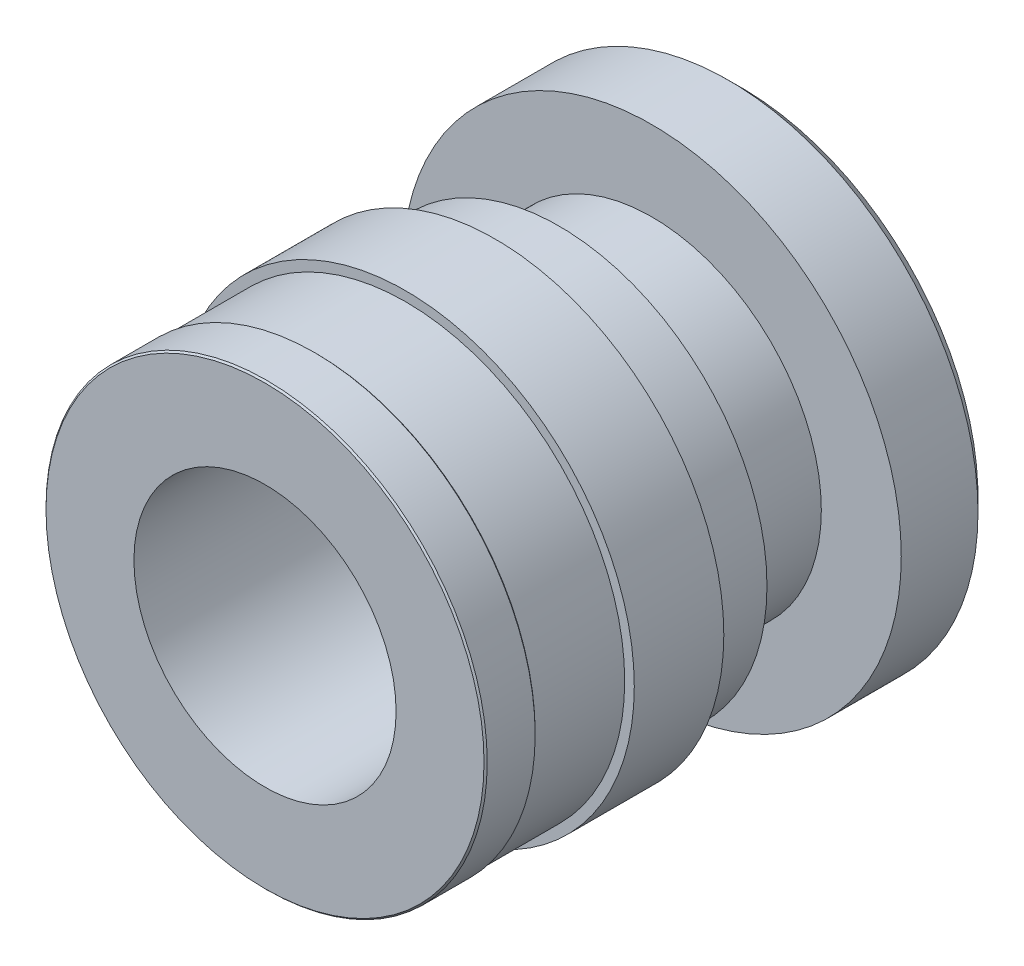
ISO-10303-21;
HEADER;
FILE_DESCRIPTION(('STEP AP214'),'2;1');
FILE_NAME('part.step','',(''),(''),'','','');
FILE_SCHEMA(('AUTOMOTIVE_DESIGN { 1 0 10303 214 1 1 1 1 }'));
ENDSEC;
DATA;
#1=APPLICATION_CONTEXT('core data for automotive mechanical design processes');
#2=APPLICATION_PROTOCOL_DEFINITION('international standard','automotive_design',2000,#1);
#3=PRODUCT_CONTEXT('',#1,'mechanical');
#4=PRODUCT('Part','Part','',(#3));
#5=PRODUCT_RELATED_PRODUCT_CATEGORY('part','',(#4));
#6=PRODUCT_DEFINITION_FORMATION('','',#4);
#7=PRODUCT_DEFINITION_CONTEXT('part definition',#1,'design');
#8=PRODUCT_DEFINITION('design','',#6,#7);
#9=PRODUCT_DEFINITION_SHAPE('','',#8);
#10=(LENGTH_UNIT() NAMED_UNIT(*) SI_UNIT(.MILLI.,.METRE.));
#11=(NAMED_UNIT(*) PLANE_ANGLE_UNIT() SI_UNIT($,.RADIAN.));
#12=(NAMED_UNIT(*) SI_UNIT($,.STERADIAN.) SOLID_ANGLE_UNIT());
#13=UNCERTAINTY_MEASURE_WITH_UNIT(LENGTH_MEASURE(1.E-05),#10,'distance_accuracy_value','');
#14=(GEOMETRIC_REPRESENTATION_CONTEXT(3) GLOBAL_UNCERTAINTY_ASSIGNED_CONTEXT((#13)) GLOBAL_UNIT_ASSIGNED_CONTEXT((#10,
#11,#12)) REPRESENTATION_CONTEXT('',''));
#15=CARTESIAN_POINT('',(0.,0.,0.));
#16=DIRECTION('',(0.,0.,1.));
#17=DIRECTION('',(1.,0.,0.));
#18=AXIS2_PLACEMENT_3D('',#15,#16,#17);
#19=CARTESIAN_POINT('',(0.02499999999999,-17.925,41.15));
#20=DIRECTION('',(0.,0.,1.));
#21=DIRECTION('',(1.,0.,0.));
#22=AXIS2_PLACEMENT_3D('',#19,#20,#21);
#23=PLANE('',#22);
#24=CARTESIAN_POINT('',(0.02499999999999,-17.925,41.15));
#25=DIRECTION('',(0.,0.,1.));
#26=DIRECTION('',(1.,0.,0.));
#27=AXIS2_PLACEMENT_3D('',#24,#25,#26);
#28=CIRCLE('',#27,2.65);
#29=CARTESIAN_POINT('',(2.67499999999999,-17.925,41.15));
#30=VERTEX_POINT('',#29);
#31=EDGE_CURVE('E41',#30,#30,#28,.T.);
#32=ORIENTED_EDGE('',*,*,#31,.T.);
#33=EDGE_LOOP('',(#32));
#34=FACE_BOUND('',#33,.T.);
#35=CARTESIAN_POINT('',(0.02499999999999,-17.925,41.15));
#36=DIRECTION('',(0.,0.,1.));
#37=DIRECTION('',(-1.,0.,0.));
#38=AXIS2_PLACEMENT_3D('',#35,#36,#37);
#39=CIRCLE('',#38,3.25);
#40=CARTESIAN_POINT('',(-3.22500000000001,-17.925,41.15));
#41=VERTEX_POINT('',#40);
#42=EDGE_CURVE('E10',#41,#41,#39,.T.);
#43=ORIENTED_EDGE('',*,*,#42,.F.);
#44=EDGE_LOOP('',(#43));
#45=FACE_BOUND('',#44,.T.);
#46=ADVANCED_FACE('F15',(#34,#45),#23,.F.);
#47=CARTESIAN_POINT('',(0.02499999999999,-17.925,41.15));
#48=DIRECTION('',(0.,0.,1.));
#49=DIRECTION('',(-1.,0.,0.));
#50=AXIS2_PLACEMENT_3D('',#47,#48,#49);
#51=CYLINDRICAL_SURFACE('',#50,3.25);
#52=ORIENTED_EDGE('',*,*,#42,.T.);
#53=EDGE_LOOP('',(#52));
#54=FACE_BOUND('',#53,.T.);
#55=CARTESIAN_POINT('',(0.02499999999999,-17.925,42.15));
#56=DIRECTION('',(0.,0.,-1.));
#57=DIRECTION('',(-1.,0.,0.));
#58=AXIS2_PLACEMENT_3D('',#55,#56,#57);
#59=CIRCLE('',#58,3.25);
#60=CARTESIAN_POINT('',(-3.22500000000001,-17.925,42.15));
#61=VERTEX_POINT('',#60);
#62=EDGE_CURVE('E18',#61,#61,#59,.T.);
#63=ORIENTED_EDGE('',*,*,#62,.T.);
#64=EDGE_LOOP('',(#63));
#65=FACE_BOUND('',#64,.T.);
#66=ADVANCED_FACE('F71',(#54,#65),#51,.T.);
#67=CARTESIAN_POINT('',(0.02499999999999,-17.925,42.15));
#68=DIRECTION('',(0.,0.,1.));
#69=DIRECTION('',(1.,0.,0.));
#70=AXIS2_PLACEMENT_3D('',#67,#68,#69);
#71=PLANE('',#70);
#72=ORIENTED_EDGE('',*,*,#62,.F.);
#73=EDGE_LOOP('',(#72));
#74=FACE_BOUND('',#73,.T.);
#75=CARTESIAN_POINT('',(0.02499999999999,-17.925,42.15));
#76=DIRECTION('',(0.,0.,1.));
#77=DIRECTION('',(-1.,0.,0.));
#78=AXIS2_PLACEMENT_3D('',#75,#76,#77);
#79=CIRCLE('',#78,3.575);
#80=CARTESIAN_POINT('',(-3.55000000000001,-17.925,42.15));
#81=VERTEX_POINT('',#80);
#82=EDGE_CURVE('E32',#81,#81,#79,.T.);
#83=ORIENTED_EDGE('',*,*,#82,.F.);
#84=EDGE_LOOP('',(#83));
#85=FACE_BOUND('',#84,.T.);
#86=ADVANCED_FACE('F68',(#74,#85),#71,.F.);
#87=CARTESIAN_POINT('',(0.02499999999999,-17.925,43.55));
#88=DIRECTION('',(0.,0.,1.));
#89=DIRECTION('',(1.,0.,0.));
#90=AXIS2_PLACEMENT_3D('',#87,#88,#89);
#91=PLANE('',#90);
#92=CARTESIAN_POINT('',(0.02499999999999,-17.925,43.55));
#93=DIRECTION('',(0.,0.,-1.));
#94=DIRECTION('',(-1.,0.,0.));
#95=AXIS2_PLACEMENT_3D('',#92,#93,#94);
#96=CIRCLE('',#95,3.425);
#97=CARTESIAN_POINT('',(-3.40000000000001,-17.925,43.55));
#98=VERTEX_POINT('',#97);
#99=EDGE_CURVE('E52',#98,#98,#96,.T.);
#100=ORIENTED_EDGE('',*,*,#99,.T.);
#101=EDGE_LOOP('',(#100));
#102=FACE_BOUND('',#101,.T.);
#103=CARTESIAN_POINT('',(0.02499999999999,-17.925,43.55));
#104=DIRECTION('',(0.,0.,1.));
#105=DIRECTION('',(-1.,0.,0.));
#106=AXIS2_PLACEMENT_3D('',#103,#104,#105);
#107=CIRCLE('',#106,3.575);
#108=CARTESIAN_POINT('',(-3.55000000000001,-17.925,43.55));
#109=VERTEX_POINT('',#108);
#110=EDGE_CURVE('E56',#109,#109,#107,.T.);
#111=ORIENTED_EDGE('',*,*,#110,.T.);
#112=EDGE_LOOP('',(#111));
#113=FACE_BOUND('',#112,.T.);
#114=ADVANCED_FACE('F70',(#102,#113),#91,.T.);
#115=CARTESIAN_POINT('',(0.02499999999999,-17.925,42.15));
#116=DIRECTION('',(0.,0.,1.));
#117=DIRECTION('',(-1.,0.,0.));
#118=AXIS2_PLACEMENT_3D('',#115,#116,#117);
#119=CYLINDRICAL_SURFACE('',#118,3.575);
#120=ORIENTED_EDGE('',*,*,#82,.T.);
#121=EDGE_LOOP('',(#120));
#122=FACE_BOUND('',#121,.T.);
#123=ORIENTED_EDGE('',*,*,#110,.F.);
#124=EDGE_LOOP('',(#123));
#125=FACE_BOUND('',#124,.T.);
#126=ADVANCED_FACE('F65',(#122,#125),#119,.T.);
#127=CARTESIAN_POINT('',(0.02499999999999,-17.925,43.55));
#128=DIRECTION('',(0.,0.,1.));
#129=DIRECTION('',(-1.,0.,0.));
#130=AXIS2_PLACEMENT_3D('',#127,#128,#129);
#131=CYLINDRICAL_SURFACE('',#130,3.425);
#132=ORIENTED_EDGE('',*,*,#99,.F.);
#133=EDGE_LOOP('',(#132));
#134=FACE_BOUND('',#133,.T.);
#135=CARTESIAN_POINT('',(0.02499999999999,-17.925,44.95));
#136=DIRECTION('',(0.,0.,1.));
#137=DIRECTION('',(-1.,0.,0.));
#138=AXIS2_PLACEMENT_3D('',#135,#136,#137);
#139=CIRCLE('',#138,3.425);
#140=CARTESIAN_POINT('',(-3.40000000000001,-17.925,44.95));
#141=VERTEX_POINT('',#140);
#142=EDGE_CURVE('E47',#141,#141,#139,.T.);
#143=ORIENTED_EDGE('',*,*,#142,.F.);
#144=EDGE_LOOP('',(#143));
#145=FACE_BOUND('',#144,.T.);
#146=ADVANCED_FACE('F134',(#134,#145),#131,.T.);
#147=CARTESIAN_POINT('',(0.02499999999999,-17.925,44.9625));
#148=DIRECTION('',(0.,0.,1.));
#149=DIRECTION('',(-1.,0.,0.));
#150=AXIS2_PLACEMENT_3D('',#147,#148,#149);
#151=CONICAL_SURFACE('',#150,3.4375,0.785398163397);
#152=CARTESIAN_POINT('',(0.02499999999999,-17.925,44.975));
#153=DIRECTION('',(0.,0.,-1.));
#154=DIRECTION('',(-1.,0.,0.));
#155=AXIS2_PLACEMENT_3D('',#152,#153,#154);
#156=CIRCLE('',#155,3.45);
#157=CARTESIAN_POINT('',(-3.42500000000001,-17.925,44.975));
#158=VERTEX_POINT('',#157);
#159=EDGE_CURVE('E43',#158,#158,#156,.T.);
#160=ORIENTED_EDGE('',*,*,#159,.T.);
#161=EDGE_LOOP('',(#160));
#162=FACE_BOUND('',#161,.T.);
#163=ORIENTED_EDGE('',*,*,#142,.T.);
#164=EDGE_LOOP('',(#163));
#165=FACE_BOUND('',#164,.T.);
#166=ADVANCED_FACE('F144',(#162,#165),#151,.T.);
#167=CARTESIAN_POINT('',(0.02499999999999,-17.925,45.75));
#168=DIRECTION('',(0.,0.,1.));
#169=DIRECTION('',(1.,0.,0.));
#170=AXIS2_PLACEMENT_3D('',#167,#168,#169);
#171=PLANE('',#170);
#172=CARTESIAN_POINT('',(0.02499999999999,-17.925,45.75));
#173=DIRECTION('',(0.,0.,-1.));
#174=DIRECTION('',(1.,0.,0.));
#175=AXIS2_PLACEMENT_3D('',#172,#173,#174);
#176=CIRCLE('',#175,2.05);
#177=CARTESIAN_POINT('',(2.07499999999999,-17.925,45.75));
#178=VERTEX_POINT('',#177);
#179=EDGE_CURVE('E100',#178,#178,#176,.T.);
#180=ORIENTED_EDGE('',*,*,#179,.T.);
#181=EDGE_LOOP('',(#180));
#182=FACE_BOUND('',#181,.T.);
#183=CARTESIAN_POINT('',(0.02499999999999,-17.925,45.75));
#184=DIRECTION('',(0.,0.,-1.));
#185=DIRECTION('',(-1.,0.,0.));
#186=AXIS2_PLACEMENT_3D('',#183,#184,#185);
#187=CIRCLE('',#186,3.425);
#188=CARTESIAN_POINT('',(-3.40000000000001,-17.925,45.75));
#189=VERTEX_POINT('',#188);
#190=EDGE_CURVE('E48',#189,#189,#187,.T.);
#191=ORIENTED_EDGE('',*,*,#190,.F.);
#192=EDGE_LOOP('',(#191));
#193=FACE_BOUND('',#192,.T.);
#194=ADVANCED_FACE('F140',(#182,#193),#171,.T.);
#195=CARTESIAN_POINT('',(0.02499999999999,-17.925,44.95));
#196=DIRECTION('',(0.,0.,1.));
#197=DIRECTION('',(-1.,0.,0.));
#198=AXIS2_PLACEMENT_3D('',#195,#196,#197);
#199=CYLINDRICAL_SURFACE('',#198,3.45);
#200=ORIENTED_EDGE('',*,*,#159,.F.);
#201=EDGE_LOOP('',(#200));
#202=FACE_BOUND('',#201,.T.);
#203=CARTESIAN_POINT('',(0.02499999999999,-17.925,45.725));
#204=DIRECTION('',(0.,0.,1.));
#205=DIRECTION('',(-1.,0.,0.));
#206=AXIS2_PLACEMENT_3D('',#203,#204,#205);
#207=CIRCLE('',#206,3.45);
#208=CARTESIAN_POINT('',(-3.42500000000001,-17.925,45.725));
#209=VERTEX_POINT('',#208);
#210=EDGE_CURVE('E91',#209,#209,#207,.T.);
#211=ORIENTED_EDGE('',*,*,#210,.F.);
#212=EDGE_LOOP('',(#211));
#213=FACE_BOUND('',#212,.T.);
#214=ADVANCED_FACE('F136',(#202,#213),#199,.T.);
#215=CARTESIAN_POINT('',(0.02499999999999,-17.925,45.7375));
#216=DIRECTION('',(0.,0.,-1.));
#217=DIRECTION('',(-1.,0.,0.));
#218=AXIS2_PLACEMENT_3D('',#215,#216,#217);
#219=CONICAL_SURFACE('',#218,3.4375,0.785398163397);
#220=ORIENTED_EDGE('',*,*,#190,.T.);
#221=EDGE_LOOP('',(#220));
#222=FACE_BOUND('',#221,.T.);
#223=ORIENTED_EDGE('',*,*,#210,.T.);
#224=EDGE_LOOP('',(#223));
#225=FACE_BOUND('',#224,.T.);
#226=ADVANCED_FACE('F139',(#222,#225),#219,.T.);
#227=CARTESIAN_POINT('',(0.02499999999999,-17.925,39.7));
#228=DIRECTION('',(0.,0.,1.));
#229=DIRECTION('',(1.,0.,0.));
#230=AXIS2_PLACEMENT_3D('',#227,#228,#229);
#231=PLANE('',#230);
#232=CARTESIAN_POINT('',(0.02499999999999,-17.925,39.7));
#233=DIRECTION('',(0.,0.,-1.));
#234=DIRECTION('',(1.,0.,0.));
#235=AXIS2_PLACEMENT_3D('',#232,#233,#234);
#236=CIRCLE('',#235,2.65);
#237=CARTESIAN_POINT('',(2.67499999999999,-17.925,39.7));
#238=VERTEX_POINT('',#237);
#239=EDGE_CURVE('E37',#238,#238,#236,.T.);
#240=ORIENTED_EDGE('',*,*,#239,.T.);
#241=EDGE_LOOP('',(#240));
#242=FACE_BOUND('',#241,.T.);
#243=CARTESIAN_POINT('',(0.02499999999999,-17.925,39.7));
#244=DIRECTION('',(0.,0.,1.));
#245=DIRECTION('',(-1.,0.,0.));
#246=AXIS2_PLACEMENT_3D('',#243,#244,#245);
#247=CIRCLE('',#246,3.9);
#248=CARTESIAN_POINT('',(-3.87500000000001,-17.925,39.7));
#249=VERTEX_POINT('',#248);
#250=EDGE_CURVE('E42',#249,#249,#247,.T.);
#251=ORIENTED_EDGE('',*,*,#250,.T.);
#252=EDGE_LOOP('',(#251));
#253=FACE_BOUND('',#252,.T.);
#254=ADVANCED_FACE('F130',(#242,#253),#231,.T.);
#255=CARTESIAN_POINT('',(0.02499999999999,-17.925,41.15));
#256=DIRECTION('',(0.,0.,-1.));
#257=DIRECTION('',(1.,0.,0.));
#258=AXIS2_PLACEMENT_3D('',#255,#256,#257);
#259=CYLINDRICAL_SURFACE('',#258,2.65);
#260=ORIENTED_EDGE('',*,*,#31,.F.);
#261=EDGE_LOOP('',(#260));
#262=FACE_BOUND('',#261,.T.);
#263=ORIENTED_EDGE('',*,*,#239,.F.);
#264=EDGE_LOOP('',(#263));
#265=FACE_BOUND('',#264,.T.);
#266=ADVANCED_FACE('F122',(#262,#265),#259,.T.);
#267=CARTESIAN_POINT('',(0.02499999999999,-17.925,38.3));
#268=DIRECTION('',(0.,0.,1.));
#269=DIRECTION('',(-1.,0.,0.));
#270=AXIS2_PLACEMENT_3D('',#267,#268,#269);
#271=CYLINDRICAL_SURFACE('',#270,3.9);
#272=CARTESIAN_POINT('',(0.02499999999999,-17.925,38.5));
#273=DIRECTION('',(0.,0.,-1.));
#274=DIRECTION('',(-1.,0.,0.));
#275=AXIS2_PLACEMENT_3D('',#272,#273,#274);
#276=CIRCLE('',#275,3.9);
#277=CARTESIAN_POINT('',(-3.87500000000001,-17.925,38.5));
#278=VERTEX_POINT('',#277);
#279=EDGE_CURVE('E35',#278,#278,#276,.T.);
#280=ORIENTED_EDGE('',*,*,#279,.F.);
#281=EDGE_LOOP('',(#280));
#282=FACE_BOUND('',#281,.T.);
#283=ORIENTED_EDGE('',*,*,#250,.F.);
#284=EDGE_LOOP('',(#283));
#285=FACE_BOUND('',#284,.T.);
#286=ADVANCED_FACE('F119',(#282,#285),#271,.T.);
#287=CARTESIAN_POINT('',(0.02499999999999,-17.925,38.4));
#288=DIRECTION('',(0.,0.,1.));
#289=DIRECTION('',(-1.,0.,0.));
#290=AXIS2_PLACEMENT_3D('',#287,#288,#289);
#291=CONICAL_SURFACE('',#290,3.8,0.785398163397);
#292=ORIENTED_EDGE('',*,*,#279,.T.);
#293=EDGE_LOOP('',(#292));
#294=FACE_BOUND('',#293,.T.);
#295=CARTESIAN_POINT('',(0.02499999999999,-17.925,38.3));
#296=DIRECTION('',(0.,0.,1.));
#297=DIRECTION('',(-1.,0.,0.));
#298=AXIS2_PLACEMENT_3D('',#295,#296,#297);
#299=CIRCLE('',#298,3.7);
#300=CARTESIAN_POINT('',(-3.67500000000001,-17.925,38.3));
#301=VERTEX_POINT('',#300);
#302=EDGE_CURVE('E103',#301,#301,#299,.T.);
#303=ORIENTED_EDGE('',*,*,#302,.T.);
#304=EDGE_LOOP('',(#303));
#305=FACE_BOUND('',#304,.T.);
#306=ADVANCED_FACE('F116',(#294,#305),#291,.T.);
#307=CARTESIAN_POINT('',(0.02499999999999,-17.925,38.3));
#308=DIRECTION('',(0.,0.,1.));
#309=DIRECTION('',(1.,0.,0.));
#310=AXIS2_PLACEMENT_3D('',#307,#308,#309);
#311=CYLINDRICAL_SURFACE('',#310,2.05);
#312=ORIENTED_EDGE('',*,*,#179,.F.);
#313=EDGE_LOOP('',(#312));
#314=FACE_BOUND('',#313,.T.);
#315=CARTESIAN_POINT('',(0.02499999999999,-17.925,38.5));
#316=DIRECTION('',(0.,0.,1.));
#317=DIRECTION('',(1.,0.,0.));
#318=AXIS2_PLACEMENT_3D('',#315,#316,#317);
#319=CIRCLE('',#318,2.05);
#320=CARTESIAN_POINT('',(2.07499999999999,-17.925,38.5));
#321=VERTEX_POINT('',#320);
#322=EDGE_CURVE('E185',#321,#321,#319,.T.);
#323=ORIENTED_EDGE('',*,*,#322,.F.);
#324=EDGE_LOOP('',(#323));
#325=FACE_BOUND('',#324,.T.);
#326=ADVANCED_FACE('F128',(#314,#325),#311,.F.);
#327=CARTESIAN_POINT('',(0.02499999999999,-17.925,38.3));
#328=DIRECTION('',(0.,0.,1.));
#329=DIRECTION('',(1.,0.,0.));
#330=AXIS2_PLACEMENT_3D('',#327,#328,#329);
#331=PLANE('',#330);
#332=CARTESIAN_POINT('',(0.02499999999999,-17.925,38.3));
#333=DIRECTION('',(0.,0.,-1.));
#334=DIRECTION('',(1.,0.,0.));
#335=AXIS2_PLACEMENT_3D('',#332,#333,#334);
#336=CIRCLE('',#335,2.25);
#337=CARTESIAN_POINT('',(2.27499999999999,-17.925,38.3));
#338=VERTEX_POINT('',#337);
#339=EDGE_CURVE('E188',#338,#338,#336,.T.);
#340=ORIENTED_EDGE('',*,*,#339,.F.);
#341=EDGE_LOOP('',(#340));
#342=FACE_BOUND('',#341,.T.);
#343=ORIENTED_EDGE('',*,*,#302,.F.);
#344=EDGE_LOOP('',(#343));
#345=FACE_BOUND('',#344,.T.);
#346=ADVANCED_FACE('F170',(#342,#345),#331,.F.);
#347=CARTESIAN_POINT('',(0.02499999999999,-17.925,38.4));
#348=DIRECTION('',(0.,0.,-1.));
#349=DIRECTION('',(1.,0.,0.));
#350=AXIS2_PLACEMENT_3D('',#347,#348,#349);
#351=CONICAL_SURFACE('',#350,2.15,0.785398163397);
#352=ORIENTED_EDGE('',*,*,#322,.T.);
#353=EDGE_LOOP('',(#352));
#354=FACE_BOUND('',#353,.T.);
#355=ORIENTED_EDGE('',*,*,#339,.T.);
#356=EDGE_LOOP('',(#355));
#357=FACE_BOUND('',#356,.T.);
#358=ADVANCED_FACE('F175',(#354,#357),#351,.F.);
#359=CLOSED_SHELL('',(#46,#66,#86,#114,#126,#146,#166,#194,#214,#226,#254,#266,#286,#306,#326,
#346,#358));
#360=MANIFOLD_SOLID_BREP('B1',#359);
#361=ADVANCED_BREP_SHAPE_REPRESENTATION('',(#18,#360),#14);
#362=SHAPE_DEFINITION_REPRESENTATION(#9,#361);
ENDSEC;
END-ISO-10303-21;
